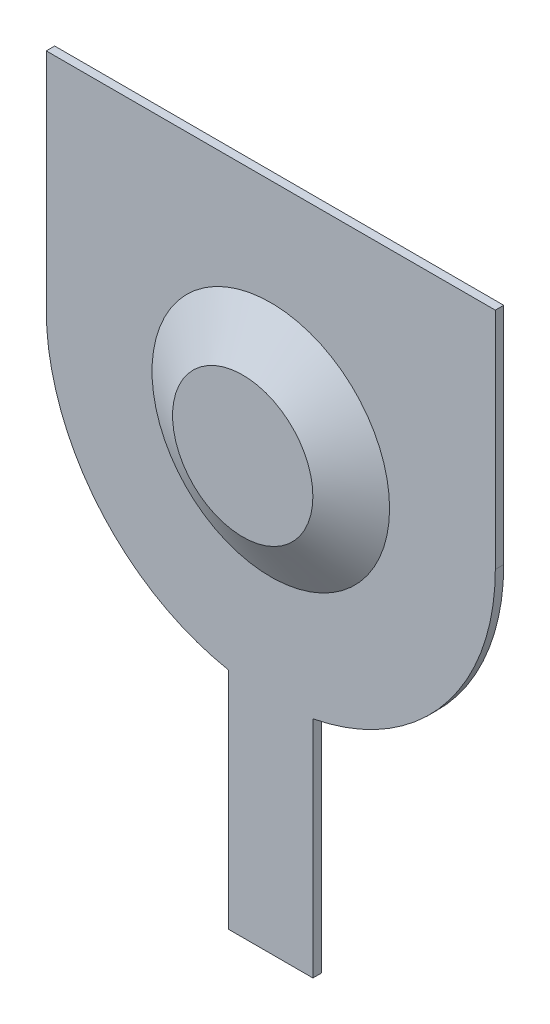
ISO-10303-21;
HEADER;
FILE_DESCRIPTION(('STEP AP214'),'2;1');
FILE_NAME('part.step','',(''),(''),'','','');
FILE_SCHEMA(('AUTOMOTIVE_DESIGN { 1 0 10303 214 1 1 1 1 }'));
ENDSEC;
DATA;
#1=APPLICATION_CONTEXT('core data for automotive mechanical design processes');
#2=APPLICATION_PROTOCOL_DEFINITION('international standard','automotive_design',2000,#1);
#3=PRODUCT_CONTEXT('',#1,'mechanical');
#4=PRODUCT('Part','Part','',(#3));
#5=PRODUCT_RELATED_PRODUCT_CATEGORY('part','',(#4));
#6=PRODUCT_DEFINITION_FORMATION('','',#4);
#7=PRODUCT_DEFINITION_CONTEXT('part definition',#1,'design');
#8=PRODUCT_DEFINITION('design','',#6,#7);
#9=PRODUCT_DEFINITION_SHAPE('','',#8);
#10=(LENGTH_UNIT() NAMED_UNIT(*) SI_UNIT(.MILLI.,.METRE.));
#11=(NAMED_UNIT(*) PLANE_ANGLE_UNIT() SI_UNIT($,.RADIAN.));
#12=(NAMED_UNIT(*) SI_UNIT($,.STERADIAN.) SOLID_ANGLE_UNIT());
#13=UNCERTAINTY_MEASURE_WITH_UNIT(LENGTH_MEASURE(1.E-05),#10,'distance_accuracy_value','');
#14=(GEOMETRIC_REPRESENTATION_CONTEXT(3) GLOBAL_UNCERTAINTY_ASSIGNED_CONTEXT((#13)) GLOBAL_UNIT_ASSIGNED_CONTEXT((#10,
#11,#12)) REPRESENTATION_CONTEXT('',''));
#15=CARTESIAN_POINT('',(0.,0.,0.));
#16=DIRECTION('',(0.,0.,1.));
#17=DIRECTION('',(1.,0.,0.));
#18=AXIS2_PLACEMENT_3D('',#15,#16,#17);
#19=CARTESIAN_POINT('',(0.,0.,0.3));
#20=DIRECTION('',(0.,0.,-1.));
#21=DIRECTION('',(-1.,0.,0.));
#22=AXIS2_PLACEMENT_3D('',#19,#20,#21);
#23=CYLINDRICAL_SURFACE('',#22,8.);
#24=CARTESIAN_POINT('',(0.,0.,0.));
#25=DIRECTION('',(0.,0.,1.));
#26=DIRECTION('',(1.,0.,0.));
#27=AXIS2_PLACEMENT_3D('',#24,#25,#26);
#28=CIRCLE('',#27,8.);
#29=CARTESIAN_POINT('',(-8.,0.,0.));
#30=VERTEX_POINT('',#29);
#31=CARTESIAN_POINT('',(-1.5,-7.85811682275086,0.));
#32=VERTEX_POINT('',#31);
#33=EDGE_CURVE('E141',#30,#32,#28,.T.);
#34=ORIENTED_EDGE('',*,*,#33,.T.);
#35=DIRECTION('',(0.,0.,-1.));
#36=VECTOR('',#35,1.);
#37=CARTESIAN_POINT('',(-1.5,-7.85811682275086,0.3));
#38=LINE('',#37,#36);
#39=CARTESIAN_POINT('',(-1.5,-7.85811682275086,0.3));
#40=VERTEX_POINT('',#39);
#41=EDGE_CURVE('E51',#40,#32,#38,.T.);
#42=ORIENTED_EDGE('',*,*,#41,.F.);
#43=CARTESIAN_POINT('',(0.,0.,0.3));
#44=DIRECTION('',(0.,0.,1.));
#45=DIRECTION('',(1.,0.,0.));
#46=AXIS2_PLACEMENT_3D('',#43,#44,#45);
#47=CIRCLE('',#46,8.);
#48=CARTESIAN_POINT('',(-8.,0.,0.3));
#49=VERTEX_POINT('',#48);
#50=EDGE_CURVE('E161',#49,#40,#47,.T.);
#51=ORIENTED_EDGE('',*,*,#50,.F.);
#52=DIRECTION('',(0.,0.,-1.));
#53=VECTOR('',#52,1.);
#54=CARTESIAN_POINT('',(-8.,0.,0.3));
#55=LINE('',#54,#53);
#56=EDGE_CURVE('E59',#49,#30,#55,.T.);
#57=ORIENTED_EDGE('',*,*,#56,.T.);
#58=EDGE_LOOP('',(#34,#42,#51,#57));
#59=FACE_BOUND('',#58,.T.);
#60=ADVANCED_FACE('F41',(#59),#23,.T.);
#61=CARTESIAN_POINT('',(-1.5,-7.85811682275086,0.3));
#62=DIRECTION('',(1.,0.,0.));
#63=DIRECTION('',(0.,1.,0.));
#64=AXIS2_PLACEMENT_3D('',#61,#62,#63);
#65=PLANE('',#64);
#66=DIRECTION('',(0.,-1.,0.));
#67=VECTOR('',#66,1.);
#68=CARTESIAN_POINT('',(-1.5,-7.85811682275086,0.));
#69=LINE('',#68,#67);
#70=CARTESIAN_POINT('',(-1.5,-15.8581168227509,0.));
#71=VERTEX_POINT('',#70);
#72=EDGE_CURVE('E143',#32,#71,#69,.T.);
#73=ORIENTED_EDGE('',*,*,#72,.T.);
#74=DIRECTION('',(0.,0.,-1.));
#75=VECTOR('',#74,1.);
#76=CARTESIAN_POINT('',(-1.5,-15.8581168227509,0.3));
#77=LINE('',#76,#75);
#78=CARTESIAN_POINT('',(-1.5,-15.8581168227509,0.3));
#79=VERTEX_POINT('',#78);
#80=EDGE_CURVE('E169',#79,#71,#77,.T.);
#81=ORIENTED_EDGE('',*,*,#80,.F.);
#82=DIRECTION('',(0.,-1.,0.));
#83=VECTOR('',#82,1.);
#84=CARTESIAN_POINT('',(-1.5,-7.85811682275086,0.3));
#85=LINE('',#84,#83);
#86=EDGE_CURVE('E98',#40,#79,#85,.T.);
#87=ORIENTED_EDGE('',*,*,#86,.F.);
#88=ORIENTED_EDGE('',*,*,#41,.T.);
#89=EDGE_LOOP('',(#73,#81,#87,#88));
#90=FACE_BOUND('',#89,.T.);
#91=ADVANCED_FACE('F172',(#90),#65,.F.);
#92=CARTESIAN_POINT('',(-1.5,-15.8581168227509,0.3));
#93=DIRECTION('',(0.,1.,0.));
#94=DIRECTION('',(0.,0.,1.));
#95=AXIS2_PLACEMENT_3D('',#92,#93,#94);
#96=PLANE('',#95);
#97=DIRECTION('',(1.,0.,0.));
#98=VECTOR('',#97,1.);
#99=CARTESIAN_POINT('',(-1.5,-15.8581168227509,0.));
#100=LINE('',#99,#98);
#101=CARTESIAN_POINT('',(1.5,-15.8581168227509,0.));
#102=VERTEX_POINT('',#101);
#103=EDGE_CURVE('E146',#71,#102,#100,.T.);
#104=ORIENTED_EDGE('',*,*,#103,.T.);
#105=DIRECTION('',(0.,0.,-1.));
#106=VECTOR('',#105,1.);
#107=CARTESIAN_POINT('',(1.5,-15.8581168227509,0.3));
#108=LINE('',#107,#106);
#109=CARTESIAN_POINT('',(1.5,-15.8581168227509,0.3));
#110=VERTEX_POINT('',#109);
#111=EDGE_CURVE('E167',#110,#102,#108,.T.);
#112=ORIENTED_EDGE('',*,*,#111,.F.);
#113=DIRECTION('',(1.,0.,0.));
#114=VECTOR('',#113,1.);
#115=CARTESIAN_POINT('',(-1.5,-15.8581168227509,0.3));
#116=LINE('',#115,#114);
#117=EDGE_CURVE('E313',#79,#110,#116,.T.);
#118=ORIENTED_EDGE('',*,*,#117,.F.);
#119=ORIENTED_EDGE('',*,*,#80,.T.);
#120=EDGE_LOOP('',(#104,#112,#118,#119));
#121=FACE_BOUND('',#120,.T.);
#122=ADVANCED_FACE('F191',(#121),#96,.F.);
#123=CARTESIAN_POINT('',(1.5,-7.85811682275086,0.3));
#124=DIRECTION('',(1.,0.,0.));
#125=DIRECTION('',(0.,1.,0.));
#126=AXIS2_PLACEMENT_3D('',#123,#124,#125);
#127=PLANE('',#126);
#128=DIRECTION('',(0.,-1.,0.));
#129=VECTOR('',#128,1.);
#130=CARTESIAN_POINT('',(1.5,-7.85811682275086,0.));
#131=LINE('',#130,#129);
#132=CARTESIAN_POINT('',(1.5,-7.85811682275086,0.));
#133=VERTEX_POINT('',#132);
#134=EDGE_CURVE('E149',#133,#102,#131,.T.);
#135=ORIENTED_EDGE('',*,*,#134,.F.);
#136=DIRECTION('',(0.,0.,-1.));
#137=VECTOR('',#136,1.);
#138=CARTESIAN_POINT('',(1.5,-7.85811682275086,0.3));
#139=LINE('',#138,#137);
#140=CARTESIAN_POINT('',(1.5,-7.85811682275086,0.3));
#141=VERTEX_POINT('',#140);
#142=EDGE_CURVE('E165',#141,#133,#139,.T.);
#143=ORIENTED_EDGE('',*,*,#142,.F.);
#144=DIRECTION('',(0.,-1.,0.));
#145=VECTOR('',#144,1.);
#146=CARTESIAN_POINT('',(1.5,-7.85811682275086,0.3));
#147=LINE('',#146,#145);
#148=EDGE_CURVE('E315',#141,#110,#147,.T.);
#149=ORIENTED_EDGE('',*,*,#148,.T.);
#150=ORIENTED_EDGE('',*,*,#111,.T.);
#151=EDGE_LOOP('',(#135,#143,#149,#150));
#152=FACE_BOUND('',#151,.T.);
#153=ADVANCED_FACE('F196',(#152),#127,.T.);
#154=CARTESIAN_POINT('',(0.,0.,0.3));
#155=DIRECTION('',(0.,0.,-1.));
#156=DIRECTION('',(-1.,0.,0.));
#157=AXIS2_PLACEMENT_3D('',#154,#155,#156);
#158=CYLINDRICAL_SURFACE('',#157,8.);
#159=CARTESIAN_POINT('',(0.,0.,0.));
#160=DIRECTION('',(0.,0.,1.));
#161=DIRECTION('',(1.,0.,0.));
#162=AXIS2_PLACEMENT_3D('',#159,#160,#161);
#163=CIRCLE('',#162,8.);
#164=CARTESIAN_POINT('',(8.,0.,0.));
#165=VERTEX_POINT('',#164);
#166=EDGE_CURVE('E152',#133,#165,#163,.T.);
#167=ORIENTED_EDGE('',*,*,#166,.T.);
#168=DIRECTION('',(0.,0.,-1.));
#169=VECTOR('',#168,1.);
#170=CARTESIAN_POINT('',(8.,0.,0.3));
#171=LINE('',#170,#169);
#172=CARTESIAN_POINT('',(8.,0.,0.3));
#173=VERTEX_POINT('',#172);
#174=EDGE_CURVE('E123',#173,#165,#171,.T.);
#175=ORIENTED_EDGE('',*,*,#174,.F.);
#176=CARTESIAN_POINT('',(0.,0.,0.3));
#177=DIRECTION('',(0.,0.,1.));
#178=DIRECTION('',(1.,0.,0.));
#179=AXIS2_PLACEMENT_3D('',#176,#177,#178);
#180=CIRCLE('',#179,8.);
#181=EDGE_CURVE('E132',#141,#173,#180,.T.);
#182=ORIENTED_EDGE('',*,*,#181,.F.);
#183=ORIENTED_EDGE('',*,*,#142,.T.);
#184=EDGE_LOOP('',(#167,#175,#182,#183));
#185=FACE_BOUND('',#184,.T.);
#186=ADVANCED_FACE('F200',(#185),#158,.T.);
#187=CARTESIAN_POINT('',(8.,8.,0.3));
#188=DIRECTION('',(1.,0.,0.));
#189=DIRECTION('',(0.,0.,-1.));
#190=AXIS2_PLACEMENT_3D('',#187,#188,#189);
#191=PLANE('',#190);
#192=DIRECTION('',(0.,-1.,0.));
#193=VECTOR('',#192,1.);
#194=CARTESIAN_POINT('',(8.,8.,0.));
#195=LINE('',#194,#193);
#196=CARTESIAN_POINT('',(8.,8.,0.));
#197=VERTEX_POINT('',#196);
#198=EDGE_CURVE('E119',#197,#165,#195,.T.);
#199=ORIENTED_EDGE('',*,*,#198,.F.);
#200=DIRECTION('',(0.,0.,-1.));
#201=VECTOR('',#200,1.);
#202=CARTESIAN_POINT('',(8.,8.,0.3));
#203=LINE('',#202,#201);
#204=CARTESIAN_POINT('',(8.,8.,0.3));
#205=VERTEX_POINT('',#204);
#206=EDGE_CURVE('E114',#205,#197,#203,.T.);
#207=ORIENTED_EDGE('',*,*,#206,.F.);
#208=DIRECTION('',(0.,-1.,0.));
#209=VECTOR('',#208,1.);
#210=CARTESIAN_POINT('',(8.,8.,0.3));
#211=LINE('',#210,#209);
#212=EDGE_CURVE('E117',#205,#173,#211,.T.);
#213=ORIENTED_EDGE('',*,*,#212,.T.);
#214=ORIENTED_EDGE('',*,*,#174,.T.);
#215=EDGE_LOOP('',(#199,#207,#213,#214));
#216=FACE_BOUND('',#215,.T.);
#217=ADVANCED_FACE('F116',(#216),#191,.T.);
#218=CARTESIAN_POINT('',(-8.,8.,0.3));
#219=DIRECTION('',(0.,1.,0.));
#220=DIRECTION('',(0.,0.,1.));
#221=AXIS2_PLACEMENT_3D('',#218,#219,#220);
#222=PLANE('',#221);
#223=DIRECTION('',(1.,0.,0.));
#224=VECTOR('',#223,1.);
#225=CARTESIAN_POINT('',(-8.,8.,0.));
#226=LINE('',#225,#224);
#227=CARTESIAN_POINT('',(-8.,8.,0.));
#228=VERTEX_POINT('',#227);
#229=EDGE_CURVE('E156',#228,#197,#226,.T.);
#230=ORIENTED_EDGE('',*,*,#229,.F.);
#231=DIRECTION('',(0.,0.,-1.));
#232=VECTOR('',#231,1.);
#233=CARTESIAN_POINT('',(-8.,8.,0.3));
#234=LINE('',#233,#232);
#235=CARTESIAN_POINT('',(-8.,8.,0.3));
#236=VERTEX_POINT('',#235);
#237=EDGE_CURVE('E85',#236,#228,#234,.T.);
#238=ORIENTED_EDGE('',*,*,#237,.F.);
#239=DIRECTION('',(1.,0.,0.));
#240=VECTOR('',#239,1.);
#241=CARTESIAN_POINT('',(-8.,8.,0.3));
#242=LINE('',#241,#240);
#243=EDGE_CURVE('E129',#236,#205,#242,.T.);
#244=ORIENTED_EDGE('',*,*,#243,.T.);
#245=ORIENTED_EDGE('',*,*,#206,.T.);
#246=EDGE_LOOP('',(#230,#238,#244,#245));
#247=FACE_BOUND('',#246,.T.);
#248=ADVANCED_FACE('F135',(#247),#222,.T.);
#249=CARTESIAN_POINT('',(-8.,0.,0.3));
#250=DIRECTION('',(-1.,0.,0.));
#251=DIRECTION('',(0.,0.,1.));
#252=AXIS2_PLACEMENT_3D('',#249,#250,#251);
#253=PLANE('',#252);
#254=DIRECTION('',(0.,1.,0.));
#255=VECTOR('',#254,1.);
#256=CARTESIAN_POINT('',(-8.,0.,0.));
#257=LINE('',#256,#255);
#258=EDGE_CURVE('E158',#30,#228,#257,.T.);
#259=ORIENTED_EDGE('',*,*,#258,.F.);
#260=ORIENTED_EDGE('',*,*,#56,.F.);
#261=DIRECTION('',(0.,1.,0.));
#262=VECTOR('',#261,1.);
#263=CARTESIAN_POINT('',(-8.,0.,0.3));
#264=LINE('',#263,#262);
#265=EDGE_CURVE('E136',#49,#236,#264,.T.);
#266=ORIENTED_EDGE('',*,*,#265,.T.);
#267=ORIENTED_EDGE('',*,*,#237,.T.);
#268=EDGE_LOOP('',(#259,#260,#266,#267));
#269=FACE_BOUND('',#268,.T.);
#270=ADVANCED_FACE('F176',(#269),#253,.T.);
#271=CARTESIAN_POINT('',(0.,0.,0.3));
#272=DIRECTION('',(0.,0.,1.));
#273=DIRECTION('',(1.,0.,0.));
#274=AXIS2_PLACEMENT_3D('',#271,#272,#273);
#275=PLANE('',#274);
#276=CARTESIAN_POINT('',(0.,0.,0.3));
#277=DIRECTION('',(0.,0.,1.));
#278=DIRECTION('',(1.,0.,0.));
#279=AXIS2_PLACEMENT_3D('',#276,#277,#278);
#280=CIRCLE('',#279,4.23205080756889);
#281=CARTESIAN_POINT('',(4.23205080756889,0.,0.3));
#282=VERTEX_POINT('',#281);
#283=EDGE_CURVE('E11',#282,#282,#280,.F.);
#284=ORIENTED_EDGE('',*,*,#283,.T.);
#285=EDGE_LOOP('',(#284));
#286=FACE_BOUND('',#285,.T.);
#287=ORIENTED_EDGE('',*,*,#50,.T.);
#288=ORIENTED_EDGE('',*,*,#86,.T.);
#289=ORIENTED_EDGE('',*,*,#117,.T.);
#290=ORIENTED_EDGE('',*,*,#148,.F.);
#291=ORIENTED_EDGE('',*,*,#181,.T.);
#292=ORIENTED_EDGE('',*,*,#212,.F.);
#293=ORIENTED_EDGE('',*,*,#243,.F.);
#294=ORIENTED_EDGE('',*,*,#265,.F.);
#295=EDGE_LOOP('',(#287,#288,#289,#290,#291,#292,#293,#294));
#296=FACE_BOUND('',#295,.T.);
#297=ADVANCED_FACE('F127',(#286,#296),#275,.T.);
#298=CARTESIAN_POINT('',(0.,0.,0.));
#299=DIRECTION('',(0.,0.,1.));
#300=DIRECTION('',(1.,0.,0.));
#301=AXIS2_PLACEMENT_3D('',#298,#299,#300);
#302=PLANE('',#301);
#303=ORIENTED_EDGE('',*,*,#33,.F.);
#304=ORIENTED_EDGE('',*,*,#258,.T.);
#305=ORIENTED_EDGE('',*,*,#229,.T.);
#306=ORIENTED_EDGE('',*,*,#198,.T.);
#307=ORIENTED_EDGE('',*,*,#166,.F.);
#308=ORIENTED_EDGE('',*,*,#134,.T.);
#309=ORIENTED_EDGE('',*,*,#103,.F.);
#310=ORIENTED_EDGE('',*,*,#72,.F.);
#311=EDGE_LOOP('',(#303,#304,#305,#306,#307,#308,#309,#310));
#312=FACE_BOUND('',#311,.T.);
#313=ADVANCED_FACE('F174',(#312),#302,.F.);
#314=CARTESIAN_POINT('',(0.,0.,1.3));
#315=DIRECTION('',(0.,0.,1.));
#316=DIRECTION('',(1.,0.,0.));
#317=AXIS2_PLACEMENT_3D('',#314,#315,#316);
#318=PLANE('',#317);
#319=CARTESIAN_POINT('',(0.,0.,1.3));
#320=DIRECTION('',(0.,0.,1.));
#321=DIRECTION('',(1.,0.,0.));
#322=AXIS2_PLACEMENT_3D('',#319,#320,#321);
#323=CIRCLE('',#322,2.5);
#324=CARTESIAN_POINT('',(2.5,0.,1.3));
#325=VERTEX_POINT('',#324);
#326=EDGE_CURVE('E144',#325,#325,#323,.T.);
#327=ORIENTED_EDGE('',*,*,#326,.T.);
#328=EDGE_LOOP('',(#327));
#329=FACE_BOUND('',#328,.T.);
#330=ADVANCED_FACE('F230',(#329),#318,.T.);
#331=CARTESIAN_POINT('',(0.,0.,1.3));
#332=DIRECTION('',(0.,0.,-1.));
#333=DIRECTION('',(-1.,0.,0.));
#334=AXIS2_PLACEMENT_3D('',#331,#332,#333);
#335=CONICAL_SURFACE('',#334,2.5,1.0471975511966);
#336=ORIENTED_EDGE('',*,*,#283,.F.);
#337=EDGE_LOOP('',(#336));
#338=FACE_BOUND('',#337,.T.);
#339=ORIENTED_EDGE('',*,*,#326,.F.);
#340=EDGE_LOOP('',(#339));
#341=FACE_BOUND('',#340,.T.);
#342=ADVANCED_FACE('F44',(#338,#341),#335,.T.);
#343=CLOSED_SHELL('',(#60,#91,#122,#153,#186,#217,#248,#270,#297,#313,#330,#342));
#344=MANIFOLD_SOLID_BREP('B2',#343);
#345=ADVANCED_BREP_SHAPE_REPRESENTATION('',(#18,#344),#14);
#346=SHAPE_DEFINITION_REPRESENTATION(#9,#345);
ENDSEC;
END-ISO-10303-21;
